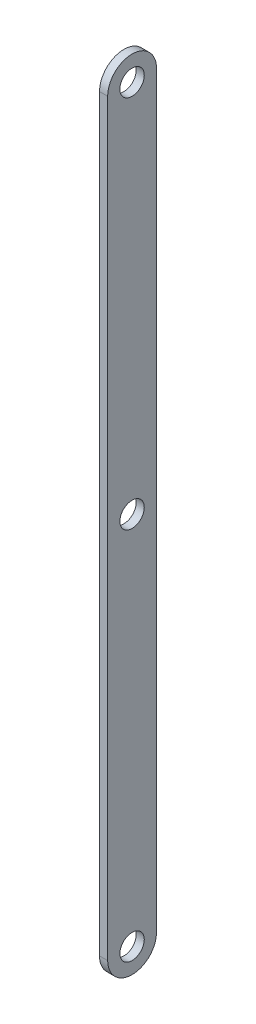
ISO-10303-21;
HEADER;
FILE_DESCRIPTION(('STEP AP214'),'2;1');
FILE_NAME('part.step','',(''),(''),'','','');
FILE_SCHEMA(('AUTOMOTIVE_DESIGN { 1 0 10303 214 1 1 1 1 }'));
ENDSEC;
DATA;
#1=APPLICATION_CONTEXT('core data for automotive mechanical design processes');
#2=APPLICATION_PROTOCOL_DEFINITION('international standard','automotive_design',2000,#1);
#3=PRODUCT_CONTEXT('',#1,'mechanical');
#4=PRODUCT('Part','Part','',(#3));
#5=PRODUCT_RELATED_PRODUCT_CATEGORY('part','',(#4));
#6=PRODUCT_DEFINITION_FORMATION('','',#4);
#7=PRODUCT_DEFINITION_CONTEXT('part definition',#1,'design');
#8=PRODUCT_DEFINITION('design','',#6,#7);
#9=PRODUCT_DEFINITION_SHAPE('','',#8);
#10=(LENGTH_UNIT() NAMED_UNIT(*) SI_UNIT(.MILLI.,.METRE.));
#11=(NAMED_UNIT(*) PLANE_ANGLE_UNIT() SI_UNIT($,.RADIAN.));
#12=(NAMED_UNIT(*) SI_UNIT($,.STERADIAN.) SOLID_ANGLE_UNIT());
#13=UNCERTAINTY_MEASURE_WITH_UNIT(LENGTH_MEASURE(1.E-05),#10,'distance_accuracy_value','');
#14=(GEOMETRIC_REPRESENTATION_CONTEXT(3) GLOBAL_UNCERTAINTY_ASSIGNED_CONTEXT((#13)) GLOBAL_UNIT_ASSIGNED_CONTEXT((#10,
#11,#12)) REPRESENTATION_CONTEXT('',''));
#15=CARTESIAN_POINT('',(0.,0.,0.));
#16=DIRECTION('',(0.,0.,1.));
#17=DIRECTION('',(1.,0.,0.));
#18=AXIS2_PLACEMENT_3D('',#15,#16,#17);
#19=CARTESIAN_POINT('',(-5.,-230.,0.));
#20=DIRECTION('',(1.,0.,0.));
#21=DIRECTION('',(0.,0.,-1.));
#22=AXIS2_PLACEMENT_3D('',#19,#20,#21);
#23=CYLINDRICAL_SURFACE('',#22,15.);
#24=CARTESIAN_POINT('',(0.,-230.,0.));
#25=DIRECTION('',(1.,0.,0.));
#26=DIRECTION('',(0.,0.,-1.));
#27=AXIS2_PLACEMENT_3D('',#24,#25,#26);
#28=CIRCLE('',#27,15.);
#29=CARTESIAN_POINT('',(0.,-230.,15.));
#30=VERTEX_POINT('',#29);
#31=CARTESIAN_POINT('',(0.,-230.,-15.));
#32=VERTEX_POINT('',#31);
#33=EDGE_CURVE('E106',#30,#32,#28,.T.);
#34=ORIENTED_EDGE('',*,*,#33,.F.);
#35=DIRECTION('',(1.,0.,0.));
#36=VECTOR('',#35,1.);
#37=CARTESIAN_POINT('',(-5.,-230.,15.));
#38=LINE('',#37,#36);
#39=CARTESIAN_POINT('',(-5.,-230.,15.));
#40=VERTEX_POINT('',#39);
#41=EDGE_CURVE('E11',#40,#30,#38,.T.);
#42=ORIENTED_EDGE('',*,*,#41,.F.);
#43=CARTESIAN_POINT('',(-5.,-230.,0.));
#44=DIRECTION('',(1.,0.,0.));
#45=DIRECTION('',(0.,0.,-1.));
#46=AXIS2_PLACEMENT_3D('',#43,#44,#45);
#47=CIRCLE('',#46,15.);
#48=CARTESIAN_POINT('',(-5.,-230.,-15.));
#49=VERTEX_POINT('',#48);
#50=EDGE_CURVE('E98',#40,#49,#47,.T.);
#51=ORIENTED_EDGE('',*,*,#50,.T.);
#52=DIRECTION('',(1.,0.,0.));
#53=VECTOR('',#52,1.);
#54=CARTESIAN_POINT('',(-5.,-230.,-15.));
#55=LINE('',#54,#53);
#56=EDGE_CURVE('E42',#49,#32,#55,.T.);
#57=ORIENTED_EDGE('',*,*,#56,.T.);
#58=EDGE_LOOP('',(#34,#42,#51,#57));
#59=FACE_BOUND('',#58,.T.);
#60=ADVANCED_FACE('F41',(#59),#23,.T.);
#61=CARTESIAN_POINT('',(-5.,-230.,15.));
#62=DIRECTION('',(0.,0.,1.));
#63=DIRECTION('',(1.,0.,0.));
#64=AXIS2_PLACEMENT_3D('',#61,#62,#63);
#65=PLANE('',#64);
#66=DIRECTION('',(0.,-1.,0.));
#67=VECTOR('',#66,1.);
#68=CARTESIAN_POINT('',(0.,-230.,15.));
#69=LINE('',#68,#67);
#70=CARTESIAN_POINT('',(0.,230.,15.));
#71=VERTEX_POINT('',#70);
#72=EDGE_CURVE('E102',#71,#30,#69,.T.);
#73=ORIENTED_EDGE('',*,*,#72,.F.);
#74=DIRECTION('',(1.,0.,0.));
#75=VECTOR('',#74,1.);
#76=CARTESIAN_POINT('',(-5.,230.,15.));
#77=LINE('',#76,#75);
#78=CARTESIAN_POINT('',(-5.,230.,15.));
#79=VERTEX_POINT('',#78);
#80=EDGE_CURVE('E49',#79,#71,#77,.T.);
#81=ORIENTED_EDGE('',*,*,#80,.F.);
#82=DIRECTION('',(0.,-1.,0.));
#83=VECTOR('',#82,1.);
#84=CARTESIAN_POINT('',(-5.,-230.,15.));
#85=LINE('',#84,#83);
#86=EDGE_CURVE('E96',#79,#40,#85,.T.);
#87=ORIENTED_EDGE('',*,*,#86,.T.);
#88=ORIENTED_EDGE('',*,*,#41,.T.);
#89=EDGE_LOOP('',(#73,#81,#87,#88));
#90=FACE_BOUND('',#89,.T.);
#91=ADVANCED_FACE('F117',(#90),#65,.T.);
#92=CARTESIAN_POINT('',(-5.,230.,0.));
#93=DIRECTION('',(1.,0.,0.));
#94=DIRECTION('',(0.,0.,-1.));
#95=AXIS2_PLACEMENT_3D('',#92,#93,#94);
#96=CYLINDRICAL_SURFACE('',#95,15.);
#97=CARTESIAN_POINT('',(0.,230.,0.));
#98=DIRECTION('',(1.,0.,0.));
#99=DIRECTION('',(0.,0.,-1.));
#100=AXIS2_PLACEMENT_3D('',#97,#98,#99);
#101=CIRCLE('',#100,15.);
#102=CARTESIAN_POINT('',(0.,230.,-15.));
#103=VERTEX_POINT('',#102);
#104=EDGE_CURVE('E91',#103,#71,#101,.T.);
#105=ORIENTED_EDGE('',*,*,#104,.F.);
#106=DIRECTION('',(1.,0.,0.));
#107=VECTOR('',#106,1.);
#108=CARTESIAN_POINT('',(-5.,230.,-15.));
#109=LINE('',#108,#107);
#110=CARTESIAN_POINT('',(-5.,230.,-15.));
#111=VERTEX_POINT('',#110);
#112=EDGE_CURVE('E86',#111,#103,#109,.T.);
#113=ORIENTED_EDGE('',*,*,#112,.F.);
#114=CARTESIAN_POINT('',(-5.,230.,0.));
#115=DIRECTION('',(1.,0.,0.));
#116=DIRECTION('',(0.,0.,-1.));
#117=AXIS2_PLACEMENT_3D('',#114,#115,#116);
#118=CIRCLE('',#117,15.);
#119=EDGE_CURVE('E87',#111,#79,#118,.T.);
#120=ORIENTED_EDGE('',*,*,#119,.T.);
#121=ORIENTED_EDGE('',*,*,#80,.T.);
#122=EDGE_LOOP('',(#105,#113,#120,#121));
#123=FACE_BOUND('',#122,.T.);
#124=ADVANCED_FACE('F88',(#123),#96,.T.);
#125=CARTESIAN_POINT('',(-5.,-230.,-15.));
#126=DIRECTION('',(0.,0.,-1.));
#127=DIRECTION('',(-1.,0.,0.));
#128=AXIS2_PLACEMENT_3D('',#125,#126,#127);
#129=PLANE('',#128);
#130=DIRECTION('',(0.,1.,0.));
#131=VECTOR('',#130,1.);
#132=CARTESIAN_POINT('',(0.,-230.,-15.));
#133=LINE('',#132,#131);
#134=EDGE_CURVE('E108',#32,#103,#133,.T.);
#135=ORIENTED_EDGE('',*,*,#134,.F.);
#136=ORIENTED_EDGE('',*,*,#56,.F.);
#137=DIRECTION('',(0.,1.,0.));
#138=VECTOR('',#137,1.);
#139=CARTESIAN_POINT('',(-5.,-230.,-15.));
#140=LINE('',#139,#138);
#141=EDGE_CURVE('E94',#49,#111,#140,.T.);
#142=ORIENTED_EDGE('',*,*,#141,.T.);
#143=ORIENTED_EDGE('',*,*,#112,.T.);
#144=EDGE_LOOP('',(#135,#136,#142,#143));
#145=FACE_BOUND('',#144,.T.);
#146=ADVANCED_FACE('F97',(#145),#129,.T.);
#147=CARTESIAN_POINT('',(-5.,-230.,0.));
#148=DIRECTION('',(1.,0.,0.));
#149=DIRECTION('',(0.,0.,-1.));
#150=AXIS2_PLACEMENT_3D('',#147,#148,#149);
#151=PLANE('',#150);
#152=CARTESIAN_POINT('',(-5.,230.,0.));
#153=DIRECTION('',(1.,0.,0.));
#154=DIRECTION('',(0.,0.,-1.));
#155=AXIS2_PLACEMENT_3D('',#152,#153,#154);
#156=CIRCLE('',#155,7.50000000000001);
#157=CARTESIAN_POINT('',(-5.,230.,-7.49999999999997));
#158=VERTEX_POINT('',#157);
#159=EDGE_CURVE('E153',#158,#158,#156,.T.);
#160=ORIENTED_EDGE('',*,*,#159,.T.);
#161=EDGE_LOOP('',(#160));
#162=FACE_BOUND('',#161,.T.);
#163=CARTESIAN_POINT('',(-5.,0.,0.));
#164=DIRECTION('',(1.,0.,0.));
#165=DIRECTION('',(0.,0.,-1.));
#166=AXIS2_PLACEMENT_3D('',#163,#164,#165);
#167=CIRCLE('',#166,7.5);
#168=CARTESIAN_POINT('',(-5.,0.,-7.5));
#169=VERTEX_POINT('',#168);
#170=EDGE_CURVE('E162',#169,#169,#167,.T.);
#171=ORIENTED_EDGE('',*,*,#170,.T.);
#172=EDGE_LOOP('',(#171));
#173=FACE_BOUND('',#172,.T.);
#174=CARTESIAN_POINT('',(-5.,-230.,0.));
#175=DIRECTION('',(1.,0.,0.));
#176=DIRECTION('',(0.,0.,-1.));
#177=AXIS2_PLACEMENT_3D('',#174,#175,#176);
#178=CIRCLE('',#177,7.50000000000001);
#179=CARTESIAN_POINT('',(-5.,-230.,-7.49999999999997));
#180=VERTEX_POINT('',#179);
#181=EDGE_CURVE('E110',#180,#180,#178,.T.);
#182=ORIENTED_EDGE('',*,*,#181,.T.);
#183=EDGE_LOOP('',(#182));
#184=FACE_BOUND('',#183,.T.);
#185=ORIENTED_EDGE('',*,*,#50,.F.);
#186=ORIENTED_EDGE('',*,*,#86,.F.);
#187=ORIENTED_EDGE('',*,*,#119,.F.);
#188=ORIENTED_EDGE('',*,*,#141,.F.);
#189=EDGE_LOOP('',(#185,#186,#187,#188));
#190=FACE_BOUND('',#189,.T.);
#191=ADVANCED_FACE('F92',(#162,#173,#184,#190),#151,.F.);
#192=CARTESIAN_POINT('',(0.,-230.,0.));
#193=DIRECTION('',(1.,0.,0.));
#194=DIRECTION('',(0.,0.,-1.));
#195=AXIS2_PLACEMENT_3D('',#192,#193,#194);
#196=PLANE('',#195);
#197=CARTESIAN_POINT('',(0.,230.,0.));
#198=DIRECTION('',(1.,0.,0.));
#199=DIRECTION('',(0.,0.,-1.));
#200=AXIS2_PLACEMENT_3D('',#197,#198,#199);
#201=CIRCLE('',#200,7.50000000000001);
#202=CARTESIAN_POINT('',(0.,230.,-7.49999999999997));
#203=VERTEX_POINT('',#202);
#204=EDGE_CURVE('E160',#203,#203,#201,.T.);
#205=ORIENTED_EDGE('',*,*,#204,.F.);
#206=EDGE_LOOP('',(#205));
#207=FACE_BOUND('',#206,.T.);
#208=CARTESIAN_POINT('',(0.,0.,0.));
#209=DIRECTION('',(1.,0.,0.));
#210=DIRECTION('',(0.,0.,-1.));
#211=AXIS2_PLACEMENT_3D('',#208,#209,#210);
#212=CIRCLE('',#211,7.5);
#213=CARTESIAN_POINT('',(0.,0.,-7.5));
#214=VERTEX_POINT('',#213);
#215=EDGE_CURVE('E159',#214,#214,#212,.T.);
#216=ORIENTED_EDGE('',*,*,#215,.F.);
#217=EDGE_LOOP('',(#216));
#218=FACE_BOUND('',#217,.T.);
#219=CARTESIAN_POINT('',(0.,-230.,0.));
#220=DIRECTION('',(1.,0.,0.));
#221=DIRECTION('',(0.,0.,-1.));
#222=AXIS2_PLACEMENT_3D('',#219,#220,#221);
#223=CIRCLE('',#222,7.50000000000001);
#224=CARTESIAN_POINT('',(0.,-230.,-7.49999999999997));
#225=VERTEX_POINT('',#224);
#226=EDGE_CURVE('E165',#225,#225,#223,.T.);
#227=ORIENTED_EDGE('',*,*,#226,.F.);
#228=EDGE_LOOP('',(#227));
#229=FACE_BOUND('',#228,.T.);
#230=ORIENTED_EDGE('',*,*,#33,.T.);
#231=ORIENTED_EDGE('',*,*,#134,.T.);
#232=ORIENTED_EDGE('',*,*,#104,.T.);
#233=ORIENTED_EDGE('',*,*,#72,.T.);
#234=EDGE_LOOP('',(#230,#231,#232,#233));
#235=FACE_BOUND('',#234,.T.);
#236=ADVANCED_FACE('F116',(#207,#218,#229,#235),#196,.T.);
#237=CARTESIAN_POINT('',(-5.,-230.,0.));
#238=DIRECTION('',(1.,0.,0.));
#239=DIRECTION('',(0.,0.,-1.));
#240=AXIS2_PLACEMENT_3D('',#237,#238,#239);
#241=CYLINDRICAL_SURFACE('',#240,7.50000000000001);
#242=ORIENTED_EDGE('',*,*,#181,.F.);
#243=EDGE_LOOP('',(#242));
#244=FACE_BOUND('',#243,.T.);
#245=ORIENTED_EDGE('',*,*,#226,.T.);
#246=EDGE_LOOP('',(#245));
#247=FACE_BOUND('',#246,.T.);
#248=ADVANCED_FACE('F134',(#244,#247),#241,.F.);
#249=CARTESIAN_POINT('',(-5.,0.,0.));
#250=DIRECTION('',(1.,0.,0.));
#251=DIRECTION('',(0.,0.,-1.));
#252=AXIS2_PLACEMENT_3D('',#249,#250,#251);
#253=CYLINDRICAL_SURFACE('',#252,7.5);
#254=ORIENTED_EDGE('',*,*,#170,.F.);
#255=EDGE_LOOP('',(#254));
#256=FACE_BOUND('',#255,.T.);
#257=ORIENTED_EDGE('',*,*,#215,.T.);
#258=EDGE_LOOP('',(#257));
#259=FACE_BOUND('',#258,.T.);
#260=ADVANCED_FACE('F145',(#256,#259),#253,.F.);
#261=CARTESIAN_POINT('',(-5.,230.,0.));
#262=DIRECTION('',(1.,0.,0.));
#263=DIRECTION('',(0.,0.,-1.));
#264=AXIS2_PLACEMENT_3D('',#261,#262,#263);
#265=CYLINDRICAL_SURFACE('',#264,7.50000000000001);
#266=ORIENTED_EDGE('',*,*,#159,.F.);
#267=EDGE_LOOP('',(#266));
#268=FACE_BOUND('',#267,.T.);
#269=ORIENTED_EDGE('',*,*,#204,.T.);
#270=EDGE_LOOP('',(#269));
#271=FACE_BOUND('',#270,.T.);
#272=ADVANCED_FACE('F147',(#268,#271),#265,.F.);
#273=CLOSED_SHELL('',(#60,#91,#124,#146,#191,#236,#248,#260,#272));
#274=MANIFOLD_SOLID_BREP('B2',#273);
#275=ADVANCED_BREP_SHAPE_REPRESENTATION('',(#18,#274),#14);
#276=SHAPE_DEFINITION_REPRESENTATION(#9,#275);
ENDSEC;
END-ISO-10303-21;
